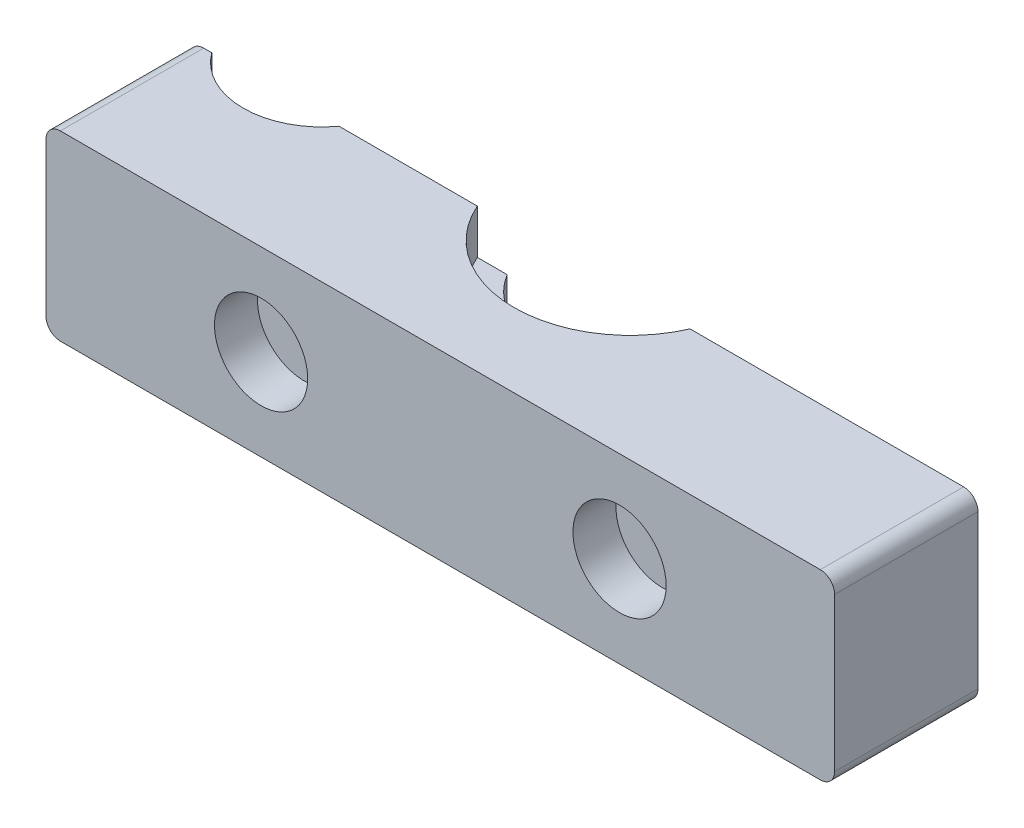
ISO-10303-21;
HEADER;
FILE_DESCRIPTION(('STEP AP214'),'2;1');
FILE_NAME('part.step','',(''),(''),'','','');
FILE_SCHEMA(('AUTOMOTIVE_DESIGN { 1 0 10303 214 1 1 1 1 }'));
ENDSEC;
DATA;
#1=APPLICATION_CONTEXT('core data for automotive mechanical design processes');
#2=APPLICATION_PROTOCOL_DEFINITION('international standard','automotive_design',2000,#1);
#3=PRODUCT_CONTEXT('',#1,'mechanical');
#4=PRODUCT('Part','Part','',(#3));
#5=PRODUCT_RELATED_PRODUCT_CATEGORY('part','',(#4));
#6=PRODUCT_DEFINITION_FORMATION('','',#4);
#7=PRODUCT_DEFINITION_CONTEXT('part definition',#1,'design');
#8=PRODUCT_DEFINITION('design','',#6,#7);
#9=PRODUCT_DEFINITION_SHAPE('','',#8);
#10=(LENGTH_UNIT() NAMED_UNIT(*) SI_UNIT(.MILLI.,.METRE.));
#11=(NAMED_UNIT(*) PLANE_ANGLE_UNIT() SI_UNIT($,.RADIAN.));
#12=(NAMED_UNIT(*) SI_UNIT($,.STERADIAN.) SOLID_ANGLE_UNIT());
#13=UNCERTAINTY_MEASURE_WITH_UNIT(LENGTH_MEASURE(1.E-05),#10,'distance_accuracy_value','');
#14=(GEOMETRIC_REPRESENTATION_CONTEXT(3) GLOBAL_UNCERTAINTY_ASSIGNED_CONTEXT((#13)) GLOBAL_UNIT_ASSIGNED_CONTEXT((#10,
#11,#12)) REPRESENTATION_CONTEXT('',''));
#15=CARTESIAN_POINT('',(0.,0.,0.));
#16=DIRECTION('',(0.,0.,1.));
#17=DIRECTION('',(1.,0.,0.));
#18=AXIS2_PLACEMENT_3D('',#15,#16,#17);
#19=CARTESIAN_POINT('',(0.,0.,0.));
#20=DIRECTION('',(0.,0.,-1.));
#21=DIRECTION('',(-1.,0.,0.));
#22=AXIS2_PLACEMENT_3D('',#19,#20,#21);
#23=PLANE('',#22);
#24=DIRECTION('',(0.,-1.,0.));
#25=VECTOR('',#24,1.);
#26=CARTESIAN_POINT('',(-27.5,6.34999999999999,0.));
#27=LINE('',#26,#25);
#28=CARTESIAN_POINT('',(-27.5,5.34999999999999,0.));
#29=VERTEX_POINT('',#28);
#30=CARTESIAN_POINT('',(-27.5,-5.35,0.));
#31=VERTEX_POINT('',#30);
#32=EDGE_CURVE('E173',#29,#31,#27,.T.);
#33=ORIENTED_EDGE('',*,*,#32,.F.);
#34=CARTESIAN_POINT('',(-26.5,5.34999999999999,0.));
#35=DIRECTION('',(0.,0.,-1.));
#36=DIRECTION('',(-1.,0.,0.));
#37=AXIS2_PLACEMENT_3D('',#34,#35,#36);
#38=CIRCLE('',#37,1.);
#39=CARTESIAN_POINT('',(-26.5,6.34999999999999,0.));
#40=VERTEX_POINT('',#39);
#41=EDGE_CURVE('E208',#29,#40,#38,.T.);
#42=ORIENTED_EDGE('',*,*,#41,.T.);
#43=DIRECTION('',(-1.,0.,0.));
#44=VECTOR('',#43,1.);
#45=CARTESIAN_POINT('',(27.5,6.35,0.));
#46=LINE('',#45,#44);
#47=CARTESIAN_POINT('',(-25.9370598373247,6.34999999999999,0.));
#48=VERTEX_POINT('',#47);
#49=EDGE_CURVE('E184',#48,#40,#46,.T.);
#50=ORIENTED_EDGE('',*,*,#49,.F.);
#51=DIRECTION('',(0.,1.,0.));
#52=VECTOR('',#51,1.);
#53=CARTESIAN_POINT('',(-25.9370598373247,-6.35000000000001,0.));
#54=LINE('',#53,#52);
#55=CARTESIAN_POINT('',(-25.9370598373247,-6.35000000000001,0.));
#56=VERTEX_POINT('',#55);
#57=EDGE_CURVE('E238',#56,#48,#54,.T.);
#58=ORIENTED_EDGE('',*,*,#57,.F.);
#59=DIRECTION('',(1.,0.,0.));
#60=VECTOR('',#59,1.);
#61=CARTESIAN_POINT('',(27.5,-6.35,0.));
#62=LINE('',#61,#60);
#63=CARTESIAN_POINT('',(-26.5,-6.35,0.));
#64=VERTEX_POINT('',#63);
#65=EDGE_CURVE('E175',#64,#56,#62,.T.);
#66=ORIENTED_EDGE('',*,*,#65,.F.);
#67=CARTESIAN_POINT('',(-26.5,-5.35,0.));
#68=DIRECTION('',(0.,0.,-1.));
#69=DIRECTION('',(-1.,0.,0.));
#70=AXIS2_PLACEMENT_3D('',#67,#68,#69);
#71=CIRCLE('',#70,1.);
#72=EDGE_CURVE('E206',#64,#31,#71,.T.);
#73=ORIENTED_EDGE('',*,*,#72,.T.);
#74=EDGE_LOOP('',(#33,#42,#50,#58,#66,#73));
#75=FACE_BOUND('',#74,.T.);
#76=ADVANCED_FACE('F39',(#75),#23,.T.);
#77=CARTESIAN_POINT('',(-12.5,0.,0.));
#78=DIRECTION('',(0.,0.,-1.));
#79=DIRECTION('',(-1.,0.,0.));
#80=AXIS2_PLACEMENT_3D('',#77,#78,#79);
#81=CIRCLE('',#80,1.75);
#82=CARTESIAN_POINT('',(-14.25,0.,0.));
#83=VERTEX_POINT('',#82);
#84=EDGE_CURVE('E302',#83,#83,#81,.T.);
#85=ORIENTED_EDGE('',*,*,#84,.F.);
#86=EDGE_LOOP('',(#85));
#87=FACE_BOUND('',#86,.T.);
#88=DIRECTION('',(1.,0.,0.));
#89=VECTOR('',#88,1.);
#90=CARTESIAN_POINT('',(0.,-2.35000000000001,0.));
#91=LINE('',#90,#89);
#92=CARTESIAN_POINT('',(-7.41940024530285,-2.35000000000001,0.));
#93=VERTEX_POINT('',#92);
#94=CARTESIAN_POINT('',(-5.33853912601566,-2.35000000000001,0.));
#95=VERTEX_POINT('',#94);
#96=EDGE_CURVE('E297',#93,#95,#91,.T.);
#97=ORIENTED_EDGE('',*,*,#96,.F.);
#98=DIRECTION('',(0.,-1.,0.));
#99=VECTOR('',#98,1.);
#100=CARTESIAN_POINT('',(-7.41940024530285,-6.35000000000001,0.));
#101=LINE('',#100,#99);
#102=CARTESIAN_POINT('',(-7.41940024530285,-6.35,0.));
#103=VERTEX_POINT('',#102);
#104=EDGE_CURVE('E295',#103,#93,#101,.F.);
#105=ORIENTED_EDGE('',*,*,#104,.F.);
#106=CARTESIAN_POINT('',(-17.0629401626753,-6.35000000000001,0.));
#107=VERTEX_POINT('',#106);
#108=EDGE_CURVE('E169',#107,#103,#62,.T.);
#109=ORIENTED_EDGE('',*,*,#108,.F.);
#110=DIRECTION('',(0.,1.,0.));
#111=VECTOR('',#110,1.);
#112=CARTESIAN_POINT('',(-17.0629401626753,-6.35000000000001,0.));
#113=LINE('',#112,#111);
#114=CARTESIAN_POINT('',(-17.0629401626753,6.35,0.));
#115=VERTEX_POINT('',#114);
#116=EDGE_CURVE('E243',#107,#115,#113,.T.);
#117=ORIENTED_EDGE('',*,*,#116,.T.);
#118=CARTESIAN_POINT('',(-7.41940024530285,6.35,0.));
#119=VERTEX_POINT('',#118);
#120=EDGE_CURVE('E189',#119,#115,#46,.T.);
#121=ORIENTED_EDGE('',*,*,#120,.F.);
#122=DIRECTION('',(0.,-1.,0.));
#123=VECTOR('',#122,1.);
#124=CARTESIAN_POINT('',(-7.41940024530285,-6.35000000000001,0.));
#125=LINE('',#124,#123);
#126=CARTESIAN_POINT('',(-7.41940024530285,3.25,0.));
#127=VERTEX_POINT('',#126);
#128=EDGE_CURVE('E279',#127,#119,#125,.F.);
#129=ORIENTED_EDGE('',*,*,#128,.F.);
#130=DIRECTION('',(-1.,0.,0.));
#131=VECTOR('',#130,1.);
#132=CARTESIAN_POINT('',(0.,3.25,0.));
#133=LINE('',#132,#131);
#134=CARTESIAN_POINT('',(-5.33853912601566,3.25,0.));
#135=VERTEX_POINT('',#134);
#136=EDGE_CURVE('E280',#135,#127,#133,.T.);
#137=ORIENTED_EDGE('',*,*,#136,.F.);
#138=DIRECTION('',(0.,1.,0.));
#139=VECTOR('',#138,1.);
#140=CARTESIAN_POINT('',(-5.33853912601565,-6.35000000000001,0.));
#141=LINE('',#140,#139);
#142=EDGE_CURVE('E177',#95,#135,#141,.T.);
#143=ORIENTED_EDGE('',*,*,#142,.F.);
#144=EDGE_LOOP('',(#97,#105,#109,#117,#121,#129,#137,#143));
#145=FACE_BOUND('',#144,.T.);
#146=ADVANCED_FACE('F356',(#87,#145),#23,.T.);
#147=CARTESIAN_POINT('',(-27.5,6.34999999999999,10.));
#148=DIRECTION('',(1.,0.,0.));
#149=DIRECTION('',(0.,0.,-1.));
#150=AXIS2_PLACEMENT_3D('',#147,#148,#149);
#151=PLANE('',#150);
#152=DIRECTION('',(0.,-1.,0.));
#153=VECTOR('',#152,1.);
#154=CARTESIAN_POINT('',(-27.5,6.34999999999999,10.));
#155=LINE('',#154,#153);
#156=CARTESIAN_POINT('',(-27.5,5.34999999999999,10.));
#157=VERTEX_POINT('',#156);
#158=CARTESIAN_POINT('',(-27.5,-5.35,10.));
#159=VERTEX_POINT('',#158);
#160=EDGE_CURVE('E193',#157,#159,#155,.T.);
#161=ORIENTED_EDGE('',*,*,#160,.F.);
#162=DIRECTION('',(0.,0.,-1.));
#163=VECTOR('',#162,1.);
#164=CARTESIAN_POINT('',(-27.5,5.34999999999999,10.));
#165=LINE('',#164,#163);
#166=EDGE_CURVE('E203',#157,#29,#165,.T.);
#167=ORIENTED_EDGE('',*,*,#166,.T.);
#168=ORIENTED_EDGE('',*,*,#32,.T.);
#169=DIRECTION('',(0.,0.,-1.));
#170=VECTOR('',#169,1.);
#171=CARTESIAN_POINT('',(-27.5,-5.35,10.));
#172=LINE('',#171,#170);
#173=EDGE_CURVE('E159',#31,#159,#172,.F.);
#174=ORIENTED_EDGE('',*,*,#173,.T.);
#175=EDGE_LOOP('',(#161,#167,#168,#174));
#176=FACE_BOUND('',#175,.T.);
#177=ADVANCED_FACE('F274',(#176),#151,.F.);
#178=CARTESIAN_POINT('',(27.5,-6.35,10.));
#179=DIRECTION('',(0.,1.,0.));
#180=DIRECTION('',(-1.,0.,0.));
#181=AXIS2_PLACEMENT_3D('',#178,#179,#180);
#182=PLANE('',#181);
#183=CARTESIAN_POINT('',(7.41940024530285,-6.35,0.));
#184=VERTEX_POINT('',#183);
#185=CARTESIAN_POINT('',(26.5,-6.35,0.));
#186=VERTEX_POINT('',#185);
#187=EDGE_CURVE('E165',#184,#186,#62,.T.);
#188=ORIENTED_EDGE('',*,*,#187,.T.);
#189=DIRECTION('',(0.,0.,-1.));
#190=VECTOR('',#189,1.);
#191=CARTESIAN_POINT('',(26.5,-6.35,10.));
#192=LINE('',#191,#190);
#193=CARTESIAN_POINT('',(26.5,-6.35,10.));
#194=VERTEX_POINT('',#193);
#195=EDGE_CURVE('E11',#186,#194,#192,.F.);
#196=ORIENTED_EDGE('',*,*,#195,.T.);
#197=DIRECTION('',(1.,0.,0.));
#198=VECTOR('',#197,1.);
#199=CARTESIAN_POINT('',(27.5,-6.35,10.));
#200=LINE('',#199,#198);
#201=CARTESIAN_POINT('',(-26.5,-6.35,10.));
#202=VERTEX_POINT('',#201);
#203=EDGE_CURVE('E231',#202,#194,#200,.T.);
#204=ORIENTED_EDGE('',*,*,#203,.F.);
#205=DIRECTION('',(0.,0.,-1.));
#206=VECTOR('',#205,1.);
#207=CARTESIAN_POINT('',(-26.5,-6.35,10.));
#208=LINE('',#207,#206);
#209=EDGE_CURVE('E47',#202,#64,#208,.T.);
#210=ORIENTED_EDGE('',*,*,#209,.T.);
#211=ORIENTED_EDGE('',*,*,#65,.T.);
#212=CARTESIAN_POINT('',(-21.5,-6.35000000000001,-3.25));
#213=DIRECTION('',(0.,1.,0.));
#214=DIRECTION('',(-1.,0.,0.));
#215=AXIS2_PLACEMENT_3D('',#212,#213,#214);
#216=CIRCLE('',#215,5.5);
#217=EDGE_CURVE('E247',#56,#107,#216,.T.);
#218=ORIENTED_EDGE('',*,*,#217,.T.);
#219=ORIENTED_EDGE('',*,*,#108,.T.);
#220=CARTESIAN_POINT('',(0.,-6.35,-3.25));
#221=DIRECTION('',(0.,-1.,0.));
#222=DIRECTION('',(1.,0.,0.));
#223=AXIS2_PLACEMENT_3D('',#220,#221,#222);
#224=CIRCLE('',#223,8.1);
#225=EDGE_CURVE('E154',#184,#103,#224,.T.);
#226=ORIENTED_EDGE('',*,*,#225,.F.);
#227=EDGE_LOOP('',(#188,#196,#204,#210,#211,#218,#219,#226));
#228=FACE_BOUND('',#227,.T.);
#229=ADVANCED_FACE('F164',(#228),#182,.F.);
#230=CARTESIAN_POINT('',(27.5,6.35,10.));
#231=DIRECTION('',(-1.,0.,0.));
#232=DIRECTION('',(0.,0.,1.));
#233=AXIS2_PLACEMENT_3D('',#230,#231,#232);
#234=PLANE('',#233);
#235=DIRECTION('',(0.,1.,0.));
#236=VECTOR('',#235,1.);
#237=CARTESIAN_POINT('',(27.5,6.35,0.));
#238=LINE('',#237,#236);
#239=CARTESIAN_POINT('',(27.5,-5.35,0.));
#240=VERTEX_POINT('',#239);
#241=CARTESIAN_POINT('',(27.5,5.35,0.));
#242=VERTEX_POINT('',#241);
#243=EDGE_CURVE('E180',#240,#242,#238,.T.);
#244=ORIENTED_EDGE('',*,*,#243,.T.);
#245=DIRECTION('',(0.,0.,-1.));
#246=VECTOR('',#245,1.);
#247=CARTESIAN_POINT('',(27.5,5.35,10.));
#248=LINE('',#247,#246);
#249=CARTESIAN_POINT('',(27.5,5.35,10.));
#250=VERTEX_POINT('',#249);
#251=EDGE_CURVE('E227',#242,#250,#248,.F.);
#252=ORIENTED_EDGE('',*,*,#251,.T.);
#253=DIRECTION('',(0.,1.,0.));
#254=VECTOR('',#253,1.);
#255=CARTESIAN_POINT('',(27.5,6.35,10.));
#256=LINE('',#255,#254);
#257=CARTESIAN_POINT('',(27.5,-5.35,10.));
#258=VERTEX_POINT('',#257);
#259=EDGE_CURVE('E257',#258,#250,#256,.T.);
#260=ORIENTED_EDGE('',*,*,#259,.F.);
#261=DIRECTION('',(0.,0.,-1.));
#262=VECTOR('',#261,1.);
#263=CARTESIAN_POINT('',(27.5,-5.35,10.));
#264=LINE('',#263,#262);
#265=EDGE_CURVE('E225',#258,#240,#264,.T.);
#266=ORIENTED_EDGE('',*,*,#265,.T.);
#267=EDGE_LOOP('',(#244,#252,#260,#266));
#268=FACE_BOUND('',#267,.T.);
#269=ADVANCED_FACE('F491',(#268),#234,.F.);
#270=CARTESIAN_POINT('',(27.5,6.35,10.));
#271=DIRECTION('',(0.,-1.,0.));
#272=DIRECTION('',(1.,0.,0.));
#273=AXIS2_PLACEMENT_3D('',#270,#271,#272);
#274=PLANE('',#273);
#275=ORIENTED_EDGE('',*,*,#49,.T.);
#276=DIRECTION('',(0.,0.,-1.));
#277=VECTOR('',#276,1.);
#278=CARTESIAN_POINT('',(-26.5,6.34999999999999,10.));
#279=LINE('',#278,#277);
#280=CARTESIAN_POINT('',(-26.5,6.34999999999999,10.));
#281=VERTEX_POINT('',#280);
#282=EDGE_CURVE('E213',#40,#281,#279,.F.);
#283=ORIENTED_EDGE('',*,*,#282,.T.);
#284=DIRECTION('',(-1.,0.,0.));
#285=VECTOR('',#284,1.);
#286=CARTESIAN_POINT('',(27.5,6.35,10.));
#287=LINE('',#286,#285);
#288=CARTESIAN_POINT('',(26.5,6.35,10.));
#289=VERTEX_POINT('',#288);
#290=EDGE_CURVE('E198',#289,#281,#287,.T.);
#291=ORIENTED_EDGE('',*,*,#290,.F.);
#292=DIRECTION('',(0.,0.,-1.));
#293=VECTOR('',#292,1.);
#294=CARTESIAN_POINT('',(26.5,6.35,10.));
#295=LINE('',#294,#293);
#296=CARTESIAN_POINT('',(26.5,6.35,0.));
#297=VERTEX_POINT('',#296);
#298=EDGE_CURVE('E210',#289,#297,#295,.T.);
#299=ORIENTED_EDGE('',*,*,#298,.T.);
#300=CARTESIAN_POINT('',(7.41940024530285,6.35,0.));
#301=VERTEX_POINT('',#300);
#302=EDGE_CURVE('E191',#297,#301,#46,.T.);
#303=ORIENTED_EDGE('',*,*,#302,.T.);
#304=CARTESIAN_POINT('',(0.,6.35,-3.25));
#305=DIRECTION('',(0.,-1.,0.));
#306=DIRECTION('',(1.,0.,0.));
#307=AXIS2_PLACEMENT_3D('',#304,#305,#306);
#308=CIRCLE('',#307,8.1);
#309=EDGE_CURVE('E293',#301,#119,#308,.T.);
#310=ORIENTED_EDGE('',*,*,#309,.T.);
#311=ORIENTED_EDGE('',*,*,#120,.T.);
#312=CARTESIAN_POINT('',(-21.5,6.35,-3.25));
#313=DIRECTION('',(0.,1.,0.));
#314=DIRECTION('',(-1.,0.,0.));
#315=AXIS2_PLACEMENT_3D('',#312,#313,#314);
#316=CIRCLE('',#315,5.5);
#317=EDGE_CURVE('E250',#48,#115,#316,.T.);
#318=ORIENTED_EDGE('',*,*,#317,.F.);
#319=EDGE_LOOP('',(#275,#283,#291,#299,#303,#310,#311,#318));
#320=FACE_BOUND('',#319,.T.);
#321=ADVANCED_FACE('F276',(#320),#274,.F.);
#322=CARTESIAN_POINT('',(0.,0.,10.));
#323=DIRECTION('',(0.,0.,-1.));
#324=DIRECTION('',(-1.,0.,0.));
#325=AXIS2_PLACEMENT_3D('',#322,#323,#324);
#326=PLANE('',#325);
#327=CARTESIAN_POINT('',(12.5,0.,10.));
#328=DIRECTION('',(0.,0.,1.));
#329=DIRECTION('',(1.,0.,0.));
#330=AXIS2_PLACEMENT_3D('',#327,#328,#329);
#331=CIRCLE('',#330,3.25);
#332=CARTESIAN_POINT('',(15.75,0.,10.));
#333=VERTEX_POINT('',#332);
#334=EDGE_CURVE('E320',#333,#333,#331,.T.);
#335=ORIENTED_EDGE('',*,*,#334,.F.);
#336=EDGE_LOOP('',(#335));
#337=FACE_BOUND('',#336,.T.);
#338=CARTESIAN_POINT('',(-12.5,0.,10.));
#339=DIRECTION('',(0.,0.,1.));
#340=DIRECTION('',(1.,0.,0.));
#341=AXIS2_PLACEMENT_3D('',#338,#339,#340);
#342=CIRCLE('',#341,3.25);
#343=CARTESIAN_POINT('',(-9.25,0.,10.));
#344=VERTEX_POINT('',#343);
#345=EDGE_CURVE('E314',#344,#344,#342,.T.);
#346=ORIENTED_EDGE('',*,*,#345,.F.);
#347=EDGE_LOOP('',(#346));
#348=FACE_BOUND('',#347,.T.);
#349=ORIENTED_EDGE('',*,*,#290,.T.);
#350=CARTESIAN_POINT('',(-26.5,5.34999999999999,10.));
#351=DIRECTION('',(0.,0.,-1.));
#352=DIRECTION('',(-1.,0.,0.));
#353=AXIS2_PLACEMENT_3D('',#350,#351,#352);
#354=CIRCLE('',#353,1.);
#355=EDGE_CURVE('E221',#281,#157,#354,.F.);
#356=ORIENTED_EDGE('',*,*,#355,.T.);
#357=ORIENTED_EDGE('',*,*,#160,.T.);
#358=CARTESIAN_POINT('',(-26.5,-5.35,10.));
#359=DIRECTION('',(0.,0.,-1.));
#360=DIRECTION('',(-1.,0.,0.));
#361=AXIS2_PLACEMENT_3D('',#358,#359,#360);
#362=CIRCLE('',#361,1.);
#363=EDGE_CURVE('E215',#159,#202,#362,.F.);
#364=ORIENTED_EDGE('',*,*,#363,.T.);
#365=ORIENTED_EDGE('',*,*,#203,.T.);
#366=CARTESIAN_POINT('',(26.5,-5.35,10.));
#367=DIRECTION('',(0.,0.,-1.));
#368=DIRECTION('',(-1.,0.,0.));
#369=AXIS2_PLACEMENT_3D('',#366,#367,#368);
#370=CIRCLE('',#369,1.);
#371=EDGE_CURVE('E217',#194,#258,#370,.F.);
#372=ORIENTED_EDGE('',*,*,#371,.T.);
#373=ORIENTED_EDGE('',*,*,#259,.T.);
#374=CARTESIAN_POINT('',(26.5,5.35,10.));
#375=DIRECTION('',(0.,0.,-1.));
#376=DIRECTION('',(-1.,0.,0.));
#377=AXIS2_PLACEMENT_3D('',#374,#375,#376);
#378=CIRCLE('',#377,1.);
#379=EDGE_CURVE('E219',#250,#289,#378,.F.);
#380=ORIENTED_EDGE('',*,*,#379,.T.);
#381=EDGE_LOOP('',(#349,#356,#357,#364,#365,#372,#373,#380));
#382=FACE_BOUND('',#381,.T.);
#383=ADVANCED_FACE('F264',(#337,#348,#382),#326,.F.);
#384=CARTESIAN_POINT('',(12.5,0.,0.));
#385=DIRECTION('',(0.,0.,-1.));
#386=DIRECTION('',(1.,0.,0.));
#387=AXIS2_PLACEMENT_3D('',#384,#385,#386);
#388=CIRCLE('',#387,1.75);
#389=CARTESIAN_POINT('',(10.75,0.,0.));
#390=VERTEX_POINT('',#389);
#391=EDGE_CURVE('E308',#390,#390,#388,.T.);
#392=ORIENTED_EDGE('',*,*,#391,.F.);
#393=EDGE_LOOP('',(#392));
#394=FACE_BOUND('',#393,.T.);
#395=ORIENTED_EDGE('',*,*,#302,.F.);
#396=CARTESIAN_POINT('',(26.5,5.35,0.));
#397=DIRECTION('',(0.,0.,-1.));
#398=DIRECTION('',(-1.,0.,0.));
#399=AXIS2_PLACEMENT_3D('',#396,#397,#398);
#400=CIRCLE('',#399,1.);
#401=EDGE_CURVE('E60',#297,#242,#400,.T.);
#402=ORIENTED_EDGE('',*,*,#401,.T.);
#403=ORIENTED_EDGE('',*,*,#243,.F.);
#404=CARTESIAN_POINT('',(26.5,-5.35,0.));
#405=DIRECTION('',(0.,0.,-1.));
#406=DIRECTION('',(-1.,0.,0.));
#407=AXIS2_PLACEMENT_3D('',#404,#405,#406);
#408=CIRCLE('',#407,1.);
#409=EDGE_CURVE('E54',#240,#186,#408,.T.);
#410=ORIENTED_EDGE('',*,*,#409,.T.);
#411=ORIENTED_EDGE('',*,*,#187,.F.);
#412=DIRECTION('',(0.,-1.,0.));
#413=VECTOR('',#412,1.);
#414=CARTESIAN_POINT('',(7.41940024530285,-6.35000000000001,0.));
#415=LINE('',#414,#413);
#416=CARTESIAN_POINT('',(7.41940024530285,-2.35000000000001,0.));
#417=VERTEX_POINT('',#416);
#418=EDGE_CURVE('E151',#417,#184,#415,.T.);
#419=ORIENTED_EDGE('',*,*,#418,.F.);
#420=DIRECTION('',(1.,0.,0.));
#421=VECTOR('',#420,1.);
#422=CARTESIAN_POINT('',(0.,-2.35000000000001,0.));
#423=LINE('',#422,#421);
#424=CARTESIAN_POINT('',(5.33853912601566,-2.35000000000001,0.));
#425=VERTEX_POINT('',#424);
#426=EDGE_CURVE('E299',#425,#417,#423,.T.);
#427=ORIENTED_EDGE('',*,*,#426,.F.);
#428=DIRECTION('',(0.,1.,0.));
#429=VECTOR('',#428,1.);
#430=CARTESIAN_POINT('',(5.33853912601566,-6.35000000000001,0.));
#431=LINE('',#430,#429);
#432=CARTESIAN_POINT('',(5.33853912601566,3.25,0.));
#433=VERTEX_POINT('',#432);
#434=EDGE_CURVE('E242',#425,#433,#431,.T.);
#435=ORIENTED_EDGE('',*,*,#434,.T.);
#436=DIRECTION('',(-1.,0.,0.));
#437=VECTOR('',#436,1.);
#438=CARTESIAN_POINT('',(0.,3.25,0.));
#439=LINE('',#438,#437);
#440=CARTESIAN_POINT('',(7.41940024530285,3.25,0.));
#441=VERTEX_POINT('',#440);
#442=EDGE_CURVE('E286',#441,#433,#439,.T.);
#443=ORIENTED_EDGE('',*,*,#442,.F.);
#444=DIRECTION('',(0.,-1.,0.));
#445=VECTOR('',#444,1.);
#446=CARTESIAN_POINT('',(7.41940024530285,-6.35000000000001,0.));
#447=LINE('',#446,#445);
#448=EDGE_CURVE('E197',#301,#441,#447,.T.);
#449=ORIENTED_EDGE('',*,*,#448,.F.);
#450=EDGE_LOOP('',(#395,#402,#403,#410,#411,#419,#427,#435,#443,#449));
#451=FACE_BOUND('',#450,.T.);
#452=ADVANCED_FACE('F172',(#394,#451),#23,.T.);
#453=CARTESIAN_POINT('',(0.,-6.35000000000001,-3.25));
#454=DIRECTION('',(0.,1.,0.));
#455=DIRECTION('',(-1.,0.,0.));
#456=AXIS2_PLACEMENT_3D('',#453,#454,#455);
#457=CYLINDRICAL_SURFACE('',#456,6.25);
#458=ORIENTED_EDGE('',*,*,#434,.F.);
#459=CARTESIAN_POINT('',(0.,-2.35000000000001,-3.25));
#460=DIRECTION('',(0.,1.,0.));
#461=DIRECTION('',(-1.,0.,0.));
#462=AXIS2_PLACEMENT_3D('',#459,#460,#461);
#463=CIRCLE('',#462,6.25);
#464=EDGE_CURVE('E160',#425,#95,#463,.F.);
#465=ORIENTED_EDGE('',*,*,#464,.T.);
#466=ORIENTED_EDGE('',*,*,#142,.T.);
#467=CARTESIAN_POINT('',(0.,3.25,-3.25));
#468=DIRECTION('',(0.,-1.,0.));
#469=DIRECTION('',(1.,0.,0.));
#470=AXIS2_PLACEMENT_3D('',#467,#468,#469);
#471=CIRCLE('',#470,6.25);
#472=EDGE_CURVE('E194',#135,#433,#471,.F.);
#473=ORIENTED_EDGE('',*,*,#472,.T.);
#474=EDGE_LOOP('',(#458,#465,#466,#473));
#475=FACE_BOUND('',#474,.T.);
#476=ADVANCED_FACE('F364',(#475),#457,.F.);
#477=CARTESIAN_POINT('',(-21.5,-6.35000000000001,-3.25));
#478=DIRECTION('',(0.,1.,0.));
#479=DIRECTION('',(-1.,0.,0.));
#480=AXIS2_PLACEMENT_3D('',#477,#478,#479);
#481=CYLINDRICAL_SURFACE('',#480,5.5);
#482=ORIENTED_EDGE('',*,*,#317,.T.);
#483=ORIENTED_EDGE('',*,*,#116,.F.);
#484=ORIENTED_EDGE('',*,*,#217,.F.);
#485=ORIENTED_EDGE('',*,*,#57,.T.);
#486=EDGE_LOOP('',(#482,#483,#484,#485));
#487=FACE_BOUND('',#486,.T.);
#488=ADVANCED_FACE('F369',(#487),#481,.F.);
#489=CARTESIAN_POINT('',(0.,3.25,-3.25));
#490=DIRECTION('',(0.,-1.,0.));
#491=DIRECTION('',(1.,0.,0.));
#492=AXIS2_PLACEMENT_3D('',#489,#490,#491);
#493=PLANE('',#492);
#494=ORIENTED_EDGE('',*,*,#136,.T.);
#495=CARTESIAN_POINT('',(0.,3.25,-3.25));
#496=DIRECTION('',(0.,-1.,0.));
#497=DIRECTION('',(1.,0.,0.));
#498=AXIS2_PLACEMENT_3D('',#495,#496,#497);
#499=CIRCLE('',#498,8.1);
#500=EDGE_CURVE('E291',#441,#127,#499,.T.);
#501=ORIENTED_EDGE('',*,*,#500,.F.);
#502=ORIENTED_EDGE('',*,*,#442,.T.);
#503=ORIENTED_EDGE('',*,*,#472,.F.);
#504=EDGE_LOOP('',(#494,#501,#502,#503));
#505=FACE_BOUND('',#504,.T.);
#506=ADVANCED_FACE('F398',(#505),#493,.F.);
#507=CARTESIAN_POINT('',(0.,-6.35000000000001,-3.25));
#508=DIRECTION('',(0.,-1.,0.));
#509=DIRECTION('',(1.,0.,0.));
#510=AXIS2_PLACEMENT_3D('',#507,#508,#509);
#511=CYLINDRICAL_SURFACE('',#510,8.1);
#512=ORIENTED_EDGE('',*,*,#128,.T.);
#513=ORIENTED_EDGE('',*,*,#309,.F.);
#514=ORIENTED_EDGE('',*,*,#448,.T.);
#515=ORIENTED_EDGE('',*,*,#500,.T.);
#516=EDGE_LOOP('',(#512,#513,#514,#515));
#517=FACE_BOUND('',#516,.T.);
#518=ADVANCED_FACE('F394',(#517),#511,.F.);
#519=CARTESIAN_POINT('',(0.,-2.35000000000001,-3.25));
#520=DIRECTION('',(0.,1.,0.));
#521=DIRECTION('',(-1.,0.,0.));
#522=AXIS2_PLACEMENT_3D('',#519,#520,#521);
#523=PLANE('',#522);
#524=ORIENTED_EDGE('',*,*,#96,.T.);
#525=ORIENTED_EDGE('',*,*,#464,.F.);
#526=ORIENTED_EDGE('',*,*,#426,.T.);
#527=CARTESIAN_POINT('',(0.,-2.35000000000001,-3.25));
#528=DIRECTION('',(0.,-1.,0.));
#529=DIRECTION('',(1.,0.,0.));
#530=AXIS2_PLACEMENT_3D('',#527,#528,#529);
#531=CIRCLE('',#530,8.1);
#532=EDGE_CURVE('E157',#417,#93,#531,.T.);
#533=ORIENTED_EDGE('',*,*,#532,.T.);
#534=EDGE_LOOP('',(#524,#525,#526,#533));
#535=FACE_BOUND('',#534,.T.);
#536=ADVANCED_FACE('F391',(#535),#523,.F.);
#537=CARTESIAN_POINT('',(0.,-6.35000000000001,-3.25));
#538=DIRECTION('',(0.,-1.,0.));
#539=DIRECTION('',(1.,0.,0.));
#540=AXIS2_PLACEMENT_3D('',#537,#538,#539);
#541=CYLINDRICAL_SURFACE('',#540,8.1);
#542=ORIENTED_EDGE('',*,*,#104,.T.);
#543=ORIENTED_EDGE('',*,*,#532,.F.);
#544=ORIENTED_EDGE('',*,*,#418,.T.);
#545=ORIENTED_EDGE('',*,*,#225,.T.);
#546=EDGE_LOOP('',(#542,#543,#544,#545));
#547=FACE_BOUND('',#546,.T.);
#548=ADVANCED_FACE('F153',(#547),#541,.F.);
#549=CARTESIAN_POINT('',(-12.5,0.,6.5));
#550=DIRECTION('',(0.,0.,-1.));
#551=DIRECTION('',(-1.,0.,0.));
#552=AXIS2_PLACEMENT_3D('',#549,#550,#551);
#553=CYLINDRICAL_SURFACE('',#552,1.75);
#554=CARTESIAN_POINT('',(-12.5,0.,6.5));
#555=DIRECTION('',(0.,0.,-1.));
#556=DIRECTION('',(-1.,0.,0.));
#557=AXIS2_PLACEMENT_3D('',#554,#555,#556);
#558=CIRCLE('',#557,1.75);
#559=CARTESIAN_POINT('',(-14.25,0.,6.5));
#560=VERTEX_POINT('',#559);
#561=EDGE_CURVE('E170',#560,#560,#558,.T.);
#562=CARTESIAN_POINT('',(-14.25,0.,6.5));
#563=CARTESIAN_POINT('',(-14.25,0.,6.43229166666667));
#564=CARTESIAN_POINT('',(-14.25,0.,6.36458333333333));
#565=CARTESIAN_POINT('',(-14.25,0.,6.22916666666667));
#566=CARTESIAN_POINT('',(-14.25,0.,6.16145833333333));
#567=CARTESIAN_POINT('',(-14.25,0.,6.02604166666667));
#568=CARTESIAN_POINT('',(-14.25,0.,5.95833333333333));
#569=CARTESIAN_POINT('',(-14.25,0.,5.82291666666667));
#570=CARTESIAN_POINT('',(-14.25,0.,5.75520833333333));
#571=CARTESIAN_POINT('',(-14.25,0.,5.61979166666667));
#572=CARTESIAN_POINT('',(-14.25,0.,5.55208333333333));
#573=CARTESIAN_POINT('',(-14.25,0.,5.41666666666667));
#574=CARTESIAN_POINT('',(-14.25,0.,5.34895833333333));
#575=CARTESIAN_POINT('',(-14.25,0.,5.21354166666667));
#576=CARTESIAN_POINT('',(-14.25,0.,5.14583333333333));
#577=CARTESIAN_POINT('',(-14.25,0.,5.01041666666667));
#578=CARTESIAN_POINT('',(-14.25,0.,4.94270833333333));
#579=CARTESIAN_POINT('',(-14.25,0.,4.80729166666667));
#580=CARTESIAN_POINT('',(-14.25,0.,4.73958333333333));
#581=CARTESIAN_POINT('',(-14.25,0.,4.60416666666667));
#582=CARTESIAN_POINT('',(-14.25,0.,4.53645833333333));
#583=CARTESIAN_POINT('',(-14.25,0.,4.40104166666667));
#584=CARTESIAN_POINT('',(-14.25,0.,4.33333333333333));
#585=CARTESIAN_POINT('',(-14.25,0.,4.19791666666667));
#586=CARTESIAN_POINT('',(-14.25,0.,4.13020833333333));
#587=CARTESIAN_POINT('',(-14.25,0.,3.99479166666667));
#588=CARTESIAN_POINT('',(-14.25,0.,3.92708333333333));
#589=CARTESIAN_POINT('',(-14.25,0.,3.79166666666667));
#590=CARTESIAN_POINT('',(-14.25,0.,3.72395833333333));
#591=CARTESIAN_POINT('',(-14.25,0.,3.58854166666667));
#592=CARTESIAN_POINT('',(-14.25,0.,3.52083333333333));
#593=CARTESIAN_POINT('',(-14.25,0.,3.38541666666667));
#594=CARTESIAN_POINT('',(-14.25,0.,3.31770833333333));
#595=CARTESIAN_POINT('',(-14.25,0.,3.18229166666667));
#596=CARTESIAN_POINT('',(-14.25,0.,3.11458333333333));
#597=CARTESIAN_POINT('',(-14.25,0.,2.97916666666667));
#598=CARTESIAN_POINT('',(-14.25,0.,2.91145833333333));
#599=CARTESIAN_POINT('',(-14.25,0.,2.77604166666667));
#600=CARTESIAN_POINT('',(-14.25,0.,2.70833333333333));
#601=CARTESIAN_POINT('',(-14.25,0.,2.57291666666667));
#602=CARTESIAN_POINT('',(-14.25,0.,2.50520833333333));
#603=CARTESIAN_POINT('',(-14.25,0.,2.36979166666667));
#604=CARTESIAN_POINT('',(-14.25,0.,2.30208333333333));
#605=CARTESIAN_POINT('',(-14.25,0.,2.16666666666667));
#606=CARTESIAN_POINT('',(-14.25,0.,2.09895833333333));
#607=CARTESIAN_POINT('',(-14.25,0.,1.96354166666667));
#608=CARTESIAN_POINT('',(-14.25,0.,1.89583333333333));
#609=CARTESIAN_POINT('',(-14.25,0.,1.76041666666667));
#610=CARTESIAN_POINT('',(-14.25,0.,1.69270833333333));
#611=CARTESIAN_POINT('',(-14.25,0.,1.55729166666667));
#612=CARTESIAN_POINT('',(-14.25,0.,1.48958333333333));
#613=CARTESIAN_POINT('',(-14.25,0.,1.35416666666667));
#614=CARTESIAN_POINT('',(-14.25,0.,1.28645833333333));
#615=CARTESIAN_POINT('',(-14.25,0.,1.15104166666667));
#616=CARTESIAN_POINT('',(-14.25,0.,1.08333333333333));
#617=CARTESIAN_POINT('',(-14.25,0.,0.947916666666667));
#618=CARTESIAN_POINT('',(-14.25,0.,0.880208333333333));
#619=CARTESIAN_POINT('',(-14.25,0.,0.744791666666667));
#620=CARTESIAN_POINT('',(-14.25,0.,0.677083333333333));
#621=CARTESIAN_POINT('',(-14.25,0.,0.541666666666667));
#622=CARTESIAN_POINT('',(-14.25,0.,0.473958333333333));
#623=CARTESIAN_POINT('',(-14.25,0.,0.338541666666667));
#624=CARTESIAN_POINT('',(-14.25,0.,0.270833333333334));
#625=CARTESIAN_POINT('',(-14.25,0.,0.135416666666667));
#626=CARTESIAN_POINT('',(-14.25,0.,0.0677083333333334));
#627=CARTESIAN_POINT('',(-14.25,0.,0.));
#628=B_SPLINE_CURVE_WITH_KNOTS('',3,(#562,#563,#564,#565,#566,#567,#568,#569,#570,#571,#572,
#573,#574,#575,#576,#577,#578,#579,#580,#581,#582,#583,#584,#585,#586,#587,#588,#589,#590,#591,
#592,#593,#594,#595,#596,#597,#598,#599,#600,#601,#602,#603,#604,#605,#606,#607,#608,#609,#610,
#611,#612,#613,#614,#615,#616,#617,#618,#619,#620,#621,#622,#623,#624,#625,#626,#627),
.UNSPECIFIED.,.F.,.F.,(4,2,2,2,2,2,2,2,2,2,2,2,2,2,2,2,2,2,2,2,2,2,2,2,2,2,2,2,2,2,2,2,4),(0.,
0.203124999999999,0.40625,0.609375,0.8125,1.015625,1.21875,1.421875,1.625,1.828125,2.03125,
2.234375,2.4375,2.640625,2.84375,3.046875,3.25,3.453125,3.65625,3.859375,4.0625,4.265625,
4.46875,4.671875,4.875,5.078125,5.28125,5.484375,5.6875,5.890625,6.09375,6.296875,6.5),.UNSPECIFIED.);
#629=EDGE_CURVE('BSEAM381',#560,#83,#628,.T.);
#630=ORIENTED_EDGE('',*,*,#561,.F.);
#631=ORIENTED_EDGE('',*,*,#84,.T.);
#632=ORIENTED_EDGE('',*,*,#629,.T.);
#633=ORIENTED_EDGE('',*,*,#629,.F.);
#634=EDGE_LOOP('',(#630,#632,#631,#633));
#635=FACE_BOUND('',#634,.T.);
#636=ADVANCED_FACE('F381',(#635),#553,.F.);
#637=CARTESIAN_POINT('',(-12.5,0.,6.5));
#638=DIRECTION('',(0.,0.,-1.));
#639=DIRECTION('',(-1.,0.,0.));
#640=AXIS2_PLACEMENT_3D('',#637,#638,#639);
#641=PLANE('',#640);
#642=ORIENTED_EDGE('',*,*,#561,.T.);
#643=EDGE_LOOP('',(#642));
#644=FACE_BOUND('',#643,.T.);
#645=ADVANCED_FACE('F375',(#644),#641,.T.);
#646=CARTESIAN_POINT('',(12.5,0.,6.5));
#647=DIRECTION('',(0.,0.,-1.));
#648=DIRECTION('',(-1.,0.,0.));
#649=AXIS2_PLACEMENT_3D('',#646,#647,#648);
#650=CYLINDRICAL_SURFACE('',#649,1.75);
#651=CARTESIAN_POINT('',(12.5,0.,6.5));
#652=DIRECTION('',(0.,0.,-1.));
#653=DIRECTION('',(1.,0.,0.));
#654=AXIS2_PLACEMENT_3D('',#651,#652,#653);
#655=CIRCLE('',#654,1.75);
#656=CARTESIAN_POINT('',(10.75,0.,6.5));
#657=VERTEX_POINT('',#656);
#658=EDGE_CURVE('E305',#657,#657,#655,.T.);
#659=CARTESIAN_POINT('',(10.75,0.,6.5));
#660=CARTESIAN_POINT('',(10.75,0.,6.43229166666667));
#661=CARTESIAN_POINT('',(10.75,0.,6.36458333333333));
#662=CARTESIAN_POINT('',(10.75,0.,6.22916666666667));
#663=CARTESIAN_POINT('',(10.75,0.,6.16145833333333));
#664=CARTESIAN_POINT('',(10.75,0.,6.02604166666667));
#665=CARTESIAN_POINT('',(10.75,0.,5.95833333333333));
#666=CARTESIAN_POINT('',(10.75,0.,5.82291666666667));
#667=CARTESIAN_POINT('',(10.75,0.,5.75520833333333));
#668=CARTESIAN_POINT('',(10.75,0.,5.61979166666667));
#669=CARTESIAN_POINT('',(10.75,0.,5.55208333333333));
#670=CARTESIAN_POINT('',(10.75,0.,5.41666666666667));
#671=CARTESIAN_POINT('',(10.75,0.,5.34895833333333));
#672=CARTESIAN_POINT('',(10.75,0.,5.21354166666667));
#673=CARTESIAN_POINT('',(10.75,0.,5.14583333333333));
#674=CARTESIAN_POINT('',(10.75,0.,5.01041666666667));
#675=CARTESIAN_POINT('',(10.75,0.,4.94270833333333));
#676=CARTESIAN_POINT('',(10.75,0.,4.80729166666667));
#677=CARTESIAN_POINT('',(10.75,0.,4.73958333333333));
#678=CARTESIAN_POINT('',(10.75,0.,4.60416666666667));
#679=CARTESIAN_POINT('',(10.75,0.,4.53645833333333));
#680=CARTESIAN_POINT('',(10.75,0.,4.40104166666667));
#681=CARTESIAN_POINT('',(10.75,0.,4.33333333333333));
#682=CARTESIAN_POINT('',(10.75,0.,4.19791666666667));
#683=CARTESIAN_POINT('',(10.75,0.,4.13020833333333));
#684=CARTESIAN_POINT('',(10.75,0.,3.99479166666667));
#685=CARTESIAN_POINT('',(10.75,0.,3.92708333333333));
#686=CARTESIAN_POINT('',(10.75,0.,3.79166666666667));
#687=CARTESIAN_POINT('',(10.75,0.,3.72395833333333));
#688=CARTESIAN_POINT('',(10.75,0.,3.58854166666667));
#689=CARTESIAN_POINT('',(10.75,0.,3.52083333333333));
#690=CARTESIAN_POINT('',(10.75,0.,3.38541666666667));
#691=CARTESIAN_POINT('',(10.75,0.,3.31770833333333));
#692=CARTESIAN_POINT('',(10.75,0.,3.18229166666667));
#693=CARTESIAN_POINT('',(10.75,0.,3.11458333333333));
#694=CARTESIAN_POINT('',(10.75,0.,2.97916666666667));
#695=CARTESIAN_POINT('',(10.75,0.,2.91145833333333));
#696=CARTESIAN_POINT('',(10.75,0.,2.77604166666667));
#697=CARTESIAN_POINT('',(10.75,0.,2.70833333333333));
#698=CARTESIAN_POINT('',(10.75,0.,2.57291666666667));
#699=CARTESIAN_POINT('',(10.75,0.,2.50520833333333));
#700=CARTESIAN_POINT('',(10.75,0.,2.36979166666667));
#701=CARTESIAN_POINT('',(10.75,0.,2.30208333333333));
#702=CARTESIAN_POINT('',(10.75,0.,2.16666666666667));
#703=CARTESIAN_POINT('',(10.75,0.,2.09895833333333));
#704=CARTESIAN_POINT('',(10.75,0.,1.96354166666667));
#705=CARTESIAN_POINT('',(10.75,0.,1.89583333333333));
#706=CARTESIAN_POINT('',(10.75,0.,1.76041666666667));
#707=CARTESIAN_POINT('',(10.75,0.,1.69270833333333));
#708=CARTESIAN_POINT('',(10.75,0.,1.55729166666667));
#709=CARTESIAN_POINT('',(10.75,0.,1.48958333333333));
#710=CARTESIAN_POINT('',(10.75,0.,1.35416666666667));
#711=CARTESIAN_POINT('',(10.75,0.,1.28645833333333));
#712=CARTESIAN_POINT('',(10.75,0.,1.15104166666667));
#713=CARTESIAN_POINT('',(10.75,0.,1.08333333333333));
#714=CARTESIAN_POINT('',(10.75,0.,0.947916666666667));
#715=CARTESIAN_POINT('',(10.75,0.,0.880208333333333));
#716=CARTESIAN_POINT('',(10.75,0.,0.744791666666667));
#717=CARTESIAN_POINT('',(10.75,0.,0.677083333333333));
#718=CARTESIAN_POINT('',(10.75,0.,0.541666666666667));
#719=CARTESIAN_POINT('',(10.75,0.,0.473958333333333));
#720=CARTESIAN_POINT('',(10.75,0.,0.338541666666667));
#721=CARTESIAN_POINT('',(10.75,0.,0.270833333333334));
#722=CARTESIAN_POINT('',(10.75,0.,0.135416666666667));
#723=CARTESIAN_POINT('',(10.75,0.,0.0677083333333334));
#724=CARTESIAN_POINT('',(10.75,0.,0.));
#725=B_SPLINE_CURVE_WITH_KNOTS('',3,(#659,#660,#661,#662,#663,#664,#665,#666,#667,#668,#669,
#670,#671,#672,#673,#674,#675,#676,#677,#678,#679,#680,#681,#682,#683,#684,#685,#686,#687,#688,
#689,#690,#691,#692,#693,#694,#695,#696,#697,#698,#699,#700,#701,#702,#703,#704,#705,#706,#707,
#708,#709,#710,#711,#712,#713,#714,#715,#716,#717,#718,#719,#720,#721,#722,#723,#724),
.UNSPECIFIED.,.F.,.F.,(4,2,2,2,2,2,2,2,2,2,2,2,2,2,2,2,2,2,2,2,2,2,2,2,2,2,2,2,2,2,2,2,4),(0.,
0.203124999999999,0.40625,0.609375,0.8125,1.015625,1.21875,1.421875,1.625,1.828125,2.03125,
2.234375,2.4375,2.640625,2.84375,3.046875,3.25,3.453125,3.65625,3.859375,4.0625,4.265625,
4.46875,4.671875,4.875,5.078125,5.28125,5.484375,5.6875,5.890625,6.09375,6.296875,6.5),.UNSPECIFIED.);
#726=EDGE_CURVE('BSEAM351',#657,#390,#725,.T.);
#727=ORIENTED_EDGE('',*,*,#658,.F.);
#728=ORIENTED_EDGE('',*,*,#391,.T.);
#729=ORIENTED_EDGE('',*,*,#726,.T.);
#730=ORIENTED_EDGE('',*,*,#726,.F.);
#731=EDGE_LOOP('',(#727,#729,#728,#730));
#732=FACE_BOUND('',#731,.T.);
#733=ADVANCED_FACE('F351',(#732),#650,.F.);
#734=CARTESIAN_POINT('',(12.5,0.,6.5));
#735=DIRECTION('',(0.,0.,1.));
#736=DIRECTION('',(1.,0.,0.));
#737=AXIS2_PLACEMENT_3D('',#734,#735,#736);
#738=PLANE('',#737);
#739=ORIENTED_EDGE('',*,*,#658,.T.);
#740=EDGE_LOOP('',(#739));
#741=FACE_BOUND('',#740,.T.);
#742=ADVANCED_FACE('F342',(#741),#738,.F.);
#743=CARTESIAN_POINT('',(-12.5,0.,7.));
#744=DIRECTION('',(0.,0.,1.));
#745=DIRECTION('',(1.,0.,0.));
#746=AXIS2_PLACEMENT_3D('',#743,#744,#745);
#747=CYLINDRICAL_SURFACE('',#746,3.25);
#748=CARTESIAN_POINT('',(-12.5,0.,7.));
#749=DIRECTION('',(0.,0.,1.));
#750=DIRECTION('',(1.,0.,0.));
#751=AXIS2_PLACEMENT_3D('',#748,#749,#750);
#752=CIRCLE('',#751,3.25);
#753=CARTESIAN_POINT('',(-9.25,0.,7.));
#754=VERTEX_POINT('',#753);
#755=EDGE_CURVE('E311',#754,#754,#752,.T.);
#756=ORIENTED_EDGE('',*,*,#755,.F.);
#757=EDGE_LOOP('',(#756));
#758=FACE_BOUND('',#757,.T.);
#759=ORIENTED_EDGE('',*,*,#345,.T.);
#760=EDGE_LOOP('',(#759));
#761=FACE_BOUND('',#760,.T.);
#762=ADVANCED_FACE('F340',(#758,#761),#747,.F.);
#763=CARTESIAN_POINT('',(-12.5,0.,7.));
#764=DIRECTION('',(0.,0.,1.));
#765=DIRECTION('',(1.,0.,0.));
#766=AXIS2_PLACEMENT_3D('',#763,#764,#765);
#767=PLANE('',#766);
#768=ORIENTED_EDGE('',*,*,#755,.T.);
#769=EDGE_LOOP('',(#768));
#770=FACE_BOUND('',#769,.T.);
#771=ADVANCED_FACE('F331',(#770),#767,.T.);
#772=CARTESIAN_POINT('',(12.5,0.,7.));
#773=DIRECTION('',(0.,0.,1.));
#774=DIRECTION('',(1.,0.,0.));
#775=AXIS2_PLACEMENT_3D('',#772,#773,#774);
#776=CYLINDRICAL_SURFACE('',#775,3.25);
#777=CARTESIAN_POINT('',(12.5,0.,7.));
#778=DIRECTION('',(0.,0.,1.));
#779=DIRECTION('',(1.,0.,0.));
#780=AXIS2_PLACEMENT_3D('',#777,#778,#779);
#781=CIRCLE('',#780,3.25);
#782=CARTESIAN_POINT('',(15.75,0.,7.));
#783=VERTEX_POINT('',#782);
#784=EDGE_CURVE('E317',#783,#783,#781,.T.);
#785=ORIENTED_EDGE('',*,*,#784,.F.);
#786=EDGE_LOOP('',(#785));
#787=FACE_BOUND('',#786,.T.);
#788=ORIENTED_EDGE('',*,*,#334,.T.);
#789=EDGE_LOOP('',(#788));
#790=FACE_BOUND('',#789,.T.);
#791=ADVANCED_FACE('F328',(#787,#790),#776,.F.);
#792=CARTESIAN_POINT('',(12.5,0.,7.));
#793=DIRECTION('',(0.,0.,1.));
#794=DIRECTION('',(1.,0.,0.));
#795=AXIS2_PLACEMENT_3D('',#792,#793,#794);
#796=PLANE('',#795);
#797=ORIENTED_EDGE('',*,*,#784,.T.);
#798=EDGE_LOOP('',(#797));
#799=FACE_BOUND('',#798,.T.);
#800=ADVANCED_FACE('F326',(#799),#796,.T.);
#801=CARTESIAN_POINT('',(-26.5,5.34999999999999,10.));
#802=DIRECTION('',(0.,0.,-1.));
#803=DIRECTION('',(-1.,0.,0.));
#804=AXIS2_PLACEMENT_3D('',#801,#802,#803);
#805=CYLINDRICAL_SURFACE('',#804,1.);
#806=ORIENTED_EDGE('',*,*,#355,.F.);
#807=ORIENTED_EDGE('',*,*,#282,.F.);
#808=ORIENTED_EDGE('',*,*,#41,.F.);
#809=ORIENTED_EDGE('',*,*,#166,.F.);
#810=EDGE_LOOP('',(#806,#807,#808,#809));
#811=FACE_BOUND('',#810,.T.);
#812=ADVANCED_FACE('F272',(#811),#805,.T.);
#813=CARTESIAN_POINT('',(26.5,5.35,10.));
#814=DIRECTION('',(0.,0.,-1.));
#815=DIRECTION('',(-1.,0.,0.));
#816=AXIS2_PLACEMENT_3D('',#813,#814,#815);
#817=CYLINDRICAL_SURFACE('',#816,1.);
#818=ORIENTED_EDGE('',*,*,#379,.F.);
#819=ORIENTED_EDGE('',*,*,#251,.F.);
#820=ORIENTED_EDGE('',*,*,#401,.F.);
#821=ORIENTED_EDGE('',*,*,#298,.F.);
#822=EDGE_LOOP('',(#818,#819,#820,#821));
#823=FACE_BOUND('',#822,.T.);
#824=ADVANCED_FACE('F523',(#823),#817,.T.);
#825=CARTESIAN_POINT('',(26.5,-5.35,10.));
#826=DIRECTION('',(0.,0.,-1.));
#827=DIRECTION('',(-1.,0.,0.));
#828=AXIS2_PLACEMENT_3D('',#825,#826,#827);
#829=CYLINDRICAL_SURFACE('',#828,1.);
#830=ORIENTED_EDGE('',*,*,#371,.F.);
#831=ORIENTED_EDGE('',*,*,#195,.F.);
#832=ORIENTED_EDGE('',*,*,#409,.F.);
#833=ORIENTED_EDGE('',*,*,#265,.F.);
#834=EDGE_LOOP('',(#830,#831,#832,#833));
#835=FACE_BOUND('',#834,.T.);
#836=ADVANCED_FACE('F532',(#835),#829,.T.);
#837=CARTESIAN_POINT('',(-26.5,-5.35,10.));
#838=DIRECTION('',(0.,0.,-1.));
#839=DIRECTION('',(-1.,0.,0.));
#840=AXIS2_PLACEMENT_3D('',#837,#838,#839);
#841=CYLINDRICAL_SURFACE('',#840,1.);
#842=ORIENTED_EDGE('',*,*,#363,.F.);
#843=ORIENTED_EDGE('',*,*,#173,.F.);
#844=ORIENTED_EDGE('',*,*,#72,.F.);
#845=ORIENTED_EDGE('',*,*,#209,.F.);
#846=EDGE_LOOP('',(#842,#843,#844,#845));
#847=FACE_BOUND('',#846,.T.);
#848=ADVANCED_FACE('F41',(#847),#841,.T.);
#849=CLOSED_SHELL('',(#76,#146,#177,#229,#269,#321,#383,#452,#476,#488,#506,#518,#536,#548,#636,
#645,#733,#742,#762,#771,#791,#800,#812,#824,#836,#848));
#850=MANIFOLD_SOLID_BREP('B2',#849);
#851=ADVANCED_BREP_SHAPE_REPRESENTATION('',(#18,#850),#14);
#852=SHAPE_DEFINITION_REPRESENTATION(#9,#851);
ENDSEC;
END-ISO-10303-21;
